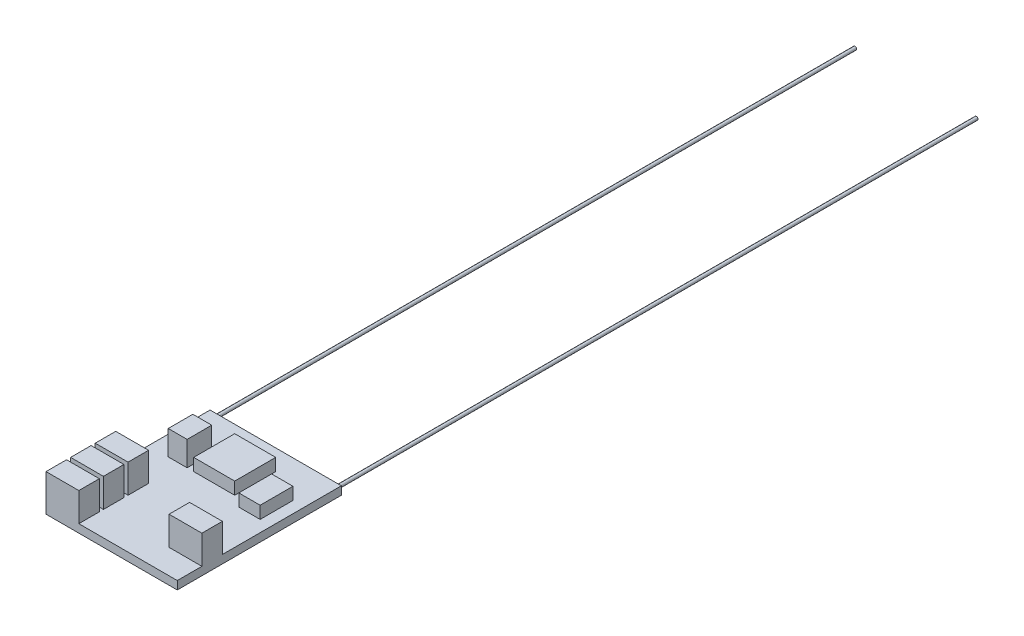
ISO-10303-21;
HEADER;
FILE_DESCRIPTION(('STEP AP214'),'2;1');
FILE_NAME('part.step','',(''),(''),'','','');
FILE_SCHEMA(('AUTOMOTIVE_DESIGN { 1 0 10303 214 1 1 1 1 }'));
ENDSEC;
DATA;
#1=APPLICATION_CONTEXT('core data for automotive mechanical design processes');
#2=APPLICATION_PROTOCOL_DEFINITION('international standard','automotive_design',2000,#1);
#3=PRODUCT_CONTEXT('',#1,'mechanical');
#4=PRODUCT('Part','Part','',(#3));
#5=PRODUCT_RELATED_PRODUCT_CATEGORY('part','',(#4));
#6=PRODUCT_DEFINITION_FORMATION('','',#4);
#7=PRODUCT_DEFINITION_CONTEXT('part definition',#1,'design');
#8=PRODUCT_DEFINITION('design','',#6,#7);
#9=PRODUCT_DEFINITION_SHAPE('','',#8);
#10=(LENGTH_UNIT() NAMED_UNIT(*) SI_UNIT(.MILLI.,.METRE.));
#11=(NAMED_UNIT(*) PLANE_ANGLE_UNIT() SI_UNIT($,.RADIAN.));
#12=(NAMED_UNIT(*) SI_UNIT($,.STERADIAN.) SOLID_ANGLE_UNIT());
#13=UNCERTAINTY_MEASURE_WITH_UNIT(LENGTH_MEASURE(1.E-05),#10,'distance_accuracy_value','');
#14=(GEOMETRIC_REPRESENTATION_CONTEXT(3) GLOBAL_UNCERTAINTY_ASSIGNED_CONTEXT((#13)) GLOBAL_UNIT_ASSIGNED_CONTEXT((#10,
#11,#12)) REPRESENTATION_CONTEXT('',''));
#15=CARTESIAN_POINT('',(0.,0.,0.));
#16=DIRECTION('',(0.,0.,1.));
#17=DIRECTION('',(1.,0.,0.));
#18=AXIS2_PLACEMENT_3D('',#15,#16,#17);
#19=CARTESIAN_POINT('',(0.,1.,0.));
#20=DIRECTION('',(0.,-1.,0.));
#21=DIRECTION('',(0.,0.,-1.));
#22=AXIS2_PLACEMENT_3D('',#19,#20,#21);
#23=PLANE('',#22);
#24=DIRECTION('',(0.,0.,1.));
#25=VECTOR('',#24,1.);
#26=CARTESIAN_POINT('',(4.,1.,-1.5));
#27=LINE('',#26,#25);
#28=CARTESIAN_POINT('',(4.,1.,-5.5));
#29=VERTEX_POINT('',#28);
#30=CARTESIAN_POINT('',(4.,1.,-1.5));
#31=VERTEX_POINT('',#30);
#32=EDGE_CURVE('E260',#29,#31,#27,.T.);
#33=ORIENTED_EDGE('',*,*,#32,.F.);
#34=DIRECTION('',(-1.,0.,0.));
#35=VECTOR('',#34,1.);
#36=CARTESIAN_POINT('',(4.,1.,-5.5));
#37=LINE('',#36,#35);
#38=CARTESIAN_POINT('',(6.6,1.,-5.5));
#39=VERTEX_POINT('',#38);
#40=EDGE_CURVE('E273',#39,#29,#37,.T.);
#41=ORIENTED_EDGE('',*,*,#40,.F.);
#42=DIRECTION('',(0.,0.,-1.));
#43=VECTOR('',#42,1.);
#44=CARTESIAN_POINT('',(6.6,1.,-1.5));
#45=LINE('',#44,#43);
#46=CARTESIAN_POINT('',(6.6,1.,-1.5));
#47=VERTEX_POINT('',#46);
#48=EDGE_CURVE('E282',#47,#39,#45,.T.);
#49=ORIENTED_EDGE('',*,*,#48,.F.);
#50=DIRECTION('',(1.,0.,0.));
#51=VECTOR('',#50,1.);
#52=CARTESIAN_POINT('',(4.,1.,-1.5));
#53=LINE('',#52,#51);
#54=EDGE_CURVE('E263',#31,#47,#53,.T.);
#55=ORIENTED_EDGE('',*,*,#54,.F.);
#56=EDGE_LOOP('',(#33,#41,#49,#55));
#57=FACE_BOUND('',#56,.T.);
#58=DIRECTION('',(-1.,0.,0.));
#59=VECTOR('',#58,1.);
#60=CARTESIAN_POINT('',(8.,1.,4.5));
#61=LINE('',#60,#59);
#62=CARTESIAN_POINT('',(8.,1.,4.5));
#63=VERTEX_POINT('',#62);
#64=CARTESIAN_POINT('',(4.,1.,4.5));
#65=VERTEX_POINT('',#64);
#66=EDGE_CURVE('E331',#63,#65,#61,.T.);
#67=ORIENTED_EDGE('',*,*,#66,.F.);
#68=DIRECTION('',(0.,0.,-1.));
#69=VECTOR('',#68,1.);
#70=CARTESIAN_POINT('',(8.,1.,10.));
#71=LINE('',#70,#69);
#72=CARTESIAN_POINT('',(8.,1.,-10.));
#73=VERTEX_POINT('',#72);
#74=EDGE_CURVE('E449',#63,#73,#71,.T.);
#75=ORIENTED_EDGE('',*,*,#74,.T.);
#76=DIRECTION('',(-1.,0.,0.));
#77=VECTOR('',#76,1.);
#78=CARTESIAN_POINT('',(-8.,1.,-10.));
#79=LINE('',#78,#77);
#80=CARTESIAN_POINT('',(-8.,1.,-10.));
#81=VERTEX_POINT('',#80);
#82=EDGE_CURVE('E448',#73,#81,#79,.T.);
#83=ORIENTED_EDGE('',*,*,#82,.T.);
#84=DIRECTION('',(0.,0.,1.));
#85=VECTOR('',#84,1.);
#86=CARTESIAN_POINT('',(-8.,1.,10.));
#87=LINE('',#86,#85);
#88=CARTESIAN_POINT('',(-8.,1.,1.5));
#89=VERTEX_POINT('',#88);
#90=EDGE_CURVE('E452',#81,#89,#87,.T.);
#91=ORIENTED_EDGE('',*,*,#90,.T.);
#92=DIRECTION('',(-1.,0.,0.));
#93=VECTOR('',#92,1.);
#94=CARTESIAN_POINT('',(-8.,1.,1.5));
#95=LINE('',#94,#93);
#96=CARTESIAN_POINT('',(-4.,1.,1.5));
#97=VERTEX_POINT('',#96);
#98=EDGE_CURVE('E366',#97,#89,#95,.T.);
#99=ORIENTED_EDGE('',*,*,#98,.F.);
#100=DIRECTION('',(0.,0.,-1.));
#101=VECTOR('',#100,1.);
#102=CARTESIAN_POINT('',(-4.,1.,4.));
#103=LINE('',#102,#101);
#104=CARTESIAN_POINT('',(-4.,1.,4.));
#105=VERTEX_POINT('',#104);
#106=EDGE_CURVE('E375',#105,#97,#103,.T.);
#107=ORIENTED_EDGE('',*,*,#106,.F.);
#108=DIRECTION('',(1.,0.,0.));
#109=VECTOR('',#108,1.);
#110=CARTESIAN_POINT('',(-8.,1.,4.));
#111=LINE('',#110,#109);
#112=CARTESIAN_POINT('',(-8.,1.,4.));
#113=VERTEX_POINT('',#112);
#114=EDGE_CURVE('E361',#113,#105,#111,.T.);
#115=ORIENTED_EDGE('',*,*,#114,.F.);
#116=CARTESIAN_POINT('',(-8.,1.,4.5));
#117=VERTEX_POINT('',#116);
#118=EDGE_CURVE('E455',#113,#117,#87,.T.);
#119=ORIENTED_EDGE('',*,*,#118,.T.);
#120=DIRECTION('',(-1.,0.,0.));
#121=VECTOR('',#120,1.);
#122=CARTESIAN_POINT('',(-8.,1.,4.5));
#123=LINE('',#122,#121);
#124=CARTESIAN_POINT('',(-4.,1.,4.5));
#125=VERTEX_POINT('',#124);
#126=EDGE_CURVE('E396',#125,#117,#123,.T.);
#127=ORIENTED_EDGE('',*,*,#126,.F.);
#128=DIRECTION('',(0.,0.,-1.));
#129=VECTOR('',#128,1.);
#130=CARTESIAN_POINT('',(-4.,1.,7.));
#131=LINE('',#130,#129);
#132=CARTESIAN_POINT('',(-4.,1.,7.));
#133=VERTEX_POINT('',#132);
#134=EDGE_CURVE('E405',#133,#125,#131,.T.);
#135=ORIENTED_EDGE('',*,*,#134,.F.);
#136=DIRECTION('',(1.,0.,0.));
#137=VECTOR('',#136,1.);
#138=CARTESIAN_POINT('',(-8.,1.,7.));
#139=LINE('',#138,#137);
#140=CARTESIAN_POINT('',(-8.,1.,7.));
#141=VERTEX_POINT('',#140);
#142=EDGE_CURVE('E391',#141,#133,#139,.T.);
#143=ORIENTED_EDGE('',*,*,#142,.F.);
#144=CARTESIAN_POINT('',(-8.,1.,7.5));
#145=VERTEX_POINT('',#144);
#146=EDGE_CURVE('E451',#141,#145,#87,.T.);
#147=ORIENTED_EDGE('',*,*,#146,.T.);
#148=DIRECTION('',(-1.,0.,0.));
#149=VECTOR('',#148,1.);
#150=CARTESIAN_POINT('',(-8.,1.,7.5));
#151=LINE('',#150,#149);
#152=CARTESIAN_POINT('',(-4.,1.,7.5));
#153=VERTEX_POINT('',#152);
#154=EDGE_CURVE('E426',#153,#145,#151,.T.);
#155=ORIENTED_EDGE('',*,*,#154,.F.);
#156=DIRECTION('',(0.,0.,-1.));
#157=VECTOR('',#156,1.);
#158=CARTESIAN_POINT('',(-4.,1.,10.));
#159=LINE('',#158,#157);
#160=CARTESIAN_POINT('',(-4.,1.,10.));
#161=VERTEX_POINT('',#160);
#162=EDGE_CURVE('E421',#161,#153,#159,.T.);
#163=ORIENTED_EDGE('',*,*,#162,.F.);
#164=DIRECTION('',(1.,0.,0.));
#165=VECTOR('',#164,1.);
#166=CARTESIAN_POINT('',(-8.,1.,10.));
#167=LINE('',#166,#165);
#168=CARTESIAN_POINT('',(8.,1.,10.));
#169=VERTEX_POINT('',#168);
#170=EDGE_CURVE('E454',#161,#169,#167,.T.);
#171=ORIENTED_EDGE('',*,*,#170,.T.);
#172=CARTESIAN_POINT('',(8.,1.,7.));
#173=VERTEX_POINT('',#172);
#174=EDGE_CURVE('E446',#169,#173,#71,.T.);
#175=ORIENTED_EDGE('',*,*,#174,.T.);
#176=DIRECTION('',(1.,0.,0.));
#177=VECTOR('',#176,1.);
#178=CARTESIAN_POINT('',(8.,1.,7.));
#179=LINE('',#178,#177);
#180=CARTESIAN_POINT('',(4.,1.,7.));
#181=VERTEX_POINT('',#180);
#182=EDGE_CURVE('E336',#181,#173,#179,.T.);
#183=ORIENTED_EDGE('',*,*,#182,.F.);
#184=DIRECTION('',(0.,0.,1.));
#185=VECTOR('',#184,1.);
#186=CARTESIAN_POINT('',(4.,1.,7.));
#187=LINE('',#186,#185);
#188=EDGE_CURVE('E345',#65,#181,#187,.T.);
#189=ORIENTED_EDGE('',*,*,#188,.F.);
#190=EDGE_LOOP('',(#67,#75,#83,#91,#99,#107,#115,#119,#127,#135,#143,#147,#155,#163,#171,#175,
#183,#189));
#191=FACE_BOUND('',#190,.T.);
#192=DIRECTION('',(0.,0.,-1.));
#193=VECTOR('',#192,1.);
#194=CARTESIAN_POINT('',(2.5,1.,-2.5));
#195=LINE('',#194,#193);
#196=CARTESIAN_POINT('',(2.5,1.,-2.5));
#197=VERTEX_POINT('',#196);
#198=CARTESIAN_POINT('',(2.5,1.,-7.5));
#199=VERTEX_POINT('',#198);
#200=EDGE_CURVE('E298',#197,#199,#195,.T.);
#201=ORIENTED_EDGE('',*,*,#200,.F.);
#202=DIRECTION('',(1.,0.,0.));
#203=VECTOR('',#202,1.);
#204=CARTESIAN_POINT('',(-2.5,1.,-2.5));
#205=LINE('',#204,#203);
#206=CARTESIAN_POINT('',(-2.5,1.,-2.5));
#207=VERTEX_POINT('',#206);
#208=EDGE_CURVE('E303',#207,#197,#205,.T.);
#209=ORIENTED_EDGE('',*,*,#208,.F.);
#210=DIRECTION('',(0.,0.,1.));
#211=VECTOR('',#210,1.);
#212=CARTESIAN_POINT('',(-2.5,1.,-2.5));
#213=LINE('',#212,#211);
#214=CARTESIAN_POINT('',(-2.5,1.,-7.5));
#215=VERTEX_POINT('',#214);
#216=EDGE_CURVE('E315',#215,#207,#213,.T.);
#217=ORIENTED_EDGE('',*,*,#216,.F.);
#218=DIRECTION('',(-1.,0.,0.));
#219=VECTOR('',#218,1.);
#220=CARTESIAN_POINT('',(-2.5,1.,-7.5));
#221=LINE('',#220,#219);
#222=EDGE_CURVE('E312',#199,#215,#221,.T.);
#223=ORIENTED_EDGE('',*,*,#222,.F.);
#224=EDGE_LOOP('',(#201,#209,#217,#223));
#225=FACE_BOUND('',#224,.T.);
#226=DIRECTION('',(0.,0.,-1.));
#227=VECTOR('',#226,1.);
#228=CARTESIAN_POINT('',(-3.3,1.,-2.5));
#229=LINE('',#228,#227);
#230=CARTESIAN_POINT('',(-3.3,1.,-2.5));
#231=VERTEX_POINT('',#230);
#232=CARTESIAN_POINT('',(-3.3,1.,-5.5));
#233=VERTEX_POINT('',#232);
#234=EDGE_CURVE('E259',#231,#233,#229,.T.);
#235=ORIENTED_EDGE('',*,*,#234,.F.);
#236=DIRECTION('',(1.,0.,0.));
#237=VECTOR('',#236,1.);
#238=CARTESIAN_POINT('',(-3.3,1.,-2.5));
#239=LINE('',#238,#237);
#240=CARTESIAN_POINT('',(-5.60257448826876,1.,-2.5));
#241=VERTEX_POINT('',#240);
#242=EDGE_CURVE('E256',#241,#231,#239,.T.);
#243=ORIENTED_EDGE('',*,*,#242,.F.);
#244=DIRECTION('',(0.,0.,1.));
#245=VECTOR('',#244,1.);
#246=CARTESIAN_POINT('',(-5.60257448826876,1.,-2.5));
#247=LINE('',#246,#245);
#248=CARTESIAN_POINT('',(-5.60257448826876,1.,-5.5));
#249=VERTEX_POINT('',#248);
#250=EDGE_CURVE('E56',#249,#241,#247,.T.);
#251=ORIENTED_EDGE('',*,*,#250,.F.);
#252=DIRECTION('',(-1.,0.,0.));
#253=VECTOR('',#252,1.);
#254=CARTESIAN_POINT('',(-3.3,1.,-5.5));
#255=LINE('',#254,#253);
#256=EDGE_CURVE('E51',#233,#249,#255,.T.);
#257=ORIENTED_EDGE('',*,*,#256,.F.);
#258=EDGE_LOOP('',(#235,#243,#251,#257));
#259=FACE_BOUND('',#258,.T.);
#260=ADVANCED_FACE('F36',(#57,#191,#225,#259),#23,.F.);
#261=CARTESIAN_POINT('',(8.,1.,10.));
#262=DIRECTION('',(-1.,0.,0.));
#263=DIRECTION('',(0.,0.,1.));
#264=AXIS2_PLACEMENT_3D('',#261,#262,#263);
#265=PLANE('',#264);
#266=DIRECTION('',(0.,0.,-1.));
#267=VECTOR('',#266,1.);
#268=CARTESIAN_POINT('',(8.,0.,10.));
#269=LINE('',#268,#267);
#270=CARTESIAN_POINT('',(8.,0.,10.));
#271=VERTEX_POINT('',#270);
#272=CARTESIAN_POINT('',(8.,0.,-10.));
#273=VERTEX_POINT('',#272);
#274=EDGE_CURVE('E445',#271,#273,#269,.T.);
#275=ORIENTED_EDGE('',*,*,#274,.T.);
#276=DIRECTION('',(0.,-1.,0.));
#277=VECTOR('',#276,1.);
#278=CARTESIAN_POINT('',(8.,1.,-10.));
#279=LINE('',#278,#277);
#280=EDGE_CURVE('E474',#73,#273,#279,.T.);
#281=ORIENTED_EDGE('',*,*,#280,.F.);
#282=ORIENTED_EDGE('',*,*,#74,.F.);
#283=DIRECTION('',(0.,-1.,0.));
#284=VECTOR('',#283,1.);
#285=CARTESIAN_POINT('',(8.,4.5,4.5));
#286=LINE('',#285,#284);
#287=CARTESIAN_POINT('',(8.,4.5,4.5));
#288=VERTEX_POINT('',#287);
#289=EDGE_CURVE('E358',#288,#63,#286,.T.);
#290=ORIENTED_EDGE('',*,*,#289,.F.);
#291=DIRECTION('',(0.,0.,-1.));
#292=VECTOR('',#291,1.);
#293=CARTESIAN_POINT('',(8.,4.5,7.));
#294=LINE('',#293,#292);
#295=CARTESIAN_POINT('',(8.,4.5,7.));
#296=VERTEX_POINT('',#295);
#297=EDGE_CURVE('E332',#296,#288,#294,.T.);
#298=ORIENTED_EDGE('',*,*,#297,.F.);
#299=DIRECTION('',(0.,-1.,0.));
#300=VECTOR('',#299,1.);
#301=CARTESIAN_POINT('',(8.,4.5,7.));
#302=LINE('',#301,#300);
#303=EDGE_CURVE('E342',#296,#173,#302,.T.);
#304=ORIENTED_EDGE('',*,*,#303,.T.);
#305=ORIENTED_EDGE('',*,*,#174,.F.);
#306=DIRECTION('',(0.,-1.,0.));
#307=VECTOR('',#306,1.);
#308=CARTESIAN_POINT('',(8.,1.,10.));
#309=LINE('',#308,#307);
#310=EDGE_CURVE('E457',#169,#271,#309,.T.);
#311=ORIENTED_EDGE('',*,*,#310,.T.);
#312=EDGE_LOOP('',(#275,#281,#282,#290,#298,#304,#305,#311));
#313=FACE_BOUND('',#312,.T.);
#314=ADVANCED_FACE('F38',(#313),#265,.F.);
#315=CARTESIAN_POINT('',(-8.,1.,-10.));
#316=DIRECTION('',(0.,0.,1.));
#317=DIRECTION('',(1.,0.,0.));
#318=AXIS2_PLACEMENT_3D('',#315,#316,#317);
#319=PLANE('',#318);
#320=CARTESIAN_POINT('',(7.4,0.5,-9.99999999999999));
#321=DIRECTION('',(0.,0.,1.));
#322=DIRECTION('',(1.,0.,0.));
#323=AXIS2_PLACEMENT_3D('',#320,#321,#322);
#324=CIRCLE('',#323,0.2);
#325=CARTESIAN_POINT('',(7.6,0.5,-9.99999999999999));
#326=VERTEX_POINT('',#325);
#327=EDGE_CURVE('E11',#326,#326,#324,.F.);
#328=ORIENTED_EDGE('',*,*,#327,.F.);
#329=EDGE_LOOP('',(#328));
#330=FACE_BOUND('',#329,.T.);
#331=CARTESIAN_POINT('',(-7.4,0.5,-9.99999999999999));
#332=DIRECTION('',(0.,0.,1.));
#333=DIRECTION('',(1.,0.,0.));
#334=AXIS2_PLACEMENT_3D('',#331,#332,#333);
#335=CIRCLE('',#334,0.2);
#336=CARTESIAN_POINT('',(-7.2,0.5,-9.99999999999999));
#337=VERTEX_POINT('',#336);
#338=EDGE_CURVE('E44',#337,#337,#335,.F.);
#339=ORIENTED_EDGE('',*,*,#338,.F.);
#340=EDGE_LOOP('',(#339));
#341=FACE_BOUND('',#340,.T.);
#342=DIRECTION('',(-1.,0.,0.));
#343=VECTOR('',#342,1.);
#344=CARTESIAN_POINT('',(-8.,0.,-10.));
#345=LINE('',#344,#343);
#346=CARTESIAN_POINT('',(-8.,0.,-10.));
#347=VERTEX_POINT('',#346);
#348=EDGE_CURVE('E460',#273,#347,#345,.T.);
#349=ORIENTED_EDGE('',*,*,#348,.T.);
#350=DIRECTION('',(0.,-1.,0.));
#351=VECTOR('',#350,1.);
#352=CARTESIAN_POINT('',(-8.,1.,-10.));
#353=LINE('',#352,#351);
#354=EDGE_CURVE('E471',#81,#347,#353,.T.);
#355=ORIENTED_EDGE('',*,*,#354,.F.);
#356=ORIENTED_EDGE('',*,*,#82,.F.);
#357=ORIENTED_EDGE('',*,*,#280,.T.);
#358=EDGE_LOOP('',(#349,#355,#356,#357));
#359=FACE_BOUND('',#358,.T.);
#360=ADVANCED_FACE('F481',(#330,#341,#359),#319,.F.);
#361=CARTESIAN_POINT('',(-8.,1.,10.));
#362=DIRECTION('',(1.,0.,0.));
#363=DIRECTION('',(0.,0.,-1.));
#364=AXIS2_PLACEMENT_3D('',#361,#362,#363);
#365=PLANE('',#364);
#366=DIRECTION('',(0.,0.,1.));
#367=VECTOR('',#366,1.);
#368=CARTESIAN_POINT('',(-8.,0.,10.));
#369=LINE('',#368,#367);
#370=CARTESIAN_POINT('',(-8.,0.,10.));
#371=VERTEX_POINT('',#370);
#372=EDGE_CURVE('E462',#347,#371,#369,.T.);
#373=ORIENTED_EDGE('',*,*,#372,.T.);
#374=DIRECTION('',(0.,-1.,0.));
#375=VECTOR('',#374,1.);
#376=CARTESIAN_POINT('',(-8.,1.,10.));
#377=LINE('',#376,#375);
#378=CARTESIAN_POINT('',(-8.,4.5,10.));
#379=VERTEX_POINT('',#378);
#380=EDGE_CURVE('E468',#379,#371,#377,.T.);
#381=ORIENTED_EDGE('',*,*,#380,.F.);
#382=DIRECTION('',(0.,0.,1.));
#383=VECTOR('',#382,1.);
#384=CARTESIAN_POINT('',(-8.,4.5,10.));
#385=LINE('',#384,#383);
#386=CARTESIAN_POINT('',(-8.,4.5,7.5));
#387=VERTEX_POINT('',#386);
#388=EDGE_CURVE('E422',#387,#379,#385,.T.);
#389=ORIENTED_EDGE('',*,*,#388,.F.);
#390=DIRECTION('',(0.,-1.,0.));
#391=VECTOR('',#390,1.);
#392=CARTESIAN_POINT('',(-8.,4.5,7.5));
#393=LINE('',#392,#391);
#394=EDGE_CURVE('E432',#387,#145,#393,.T.);
#395=ORIENTED_EDGE('',*,*,#394,.T.);
#396=ORIENTED_EDGE('',*,*,#146,.F.);
#397=DIRECTION('',(0.,-1.,0.));
#398=VECTOR('',#397,1.);
#399=CARTESIAN_POINT('',(-8.,4.5,7.));
#400=LINE('',#399,#398);
#401=CARTESIAN_POINT('',(-8.,4.5,7.));
#402=VERTEX_POINT('',#401);
#403=EDGE_CURVE('E402',#402,#141,#400,.T.);
#404=ORIENTED_EDGE('',*,*,#403,.F.);
#405=DIRECTION('',(0.,0.,1.));
#406=VECTOR('',#405,1.);
#407=CARTESIAN_POINT('',(-8.,4.5,7.));
#408=LINE('',#407,#406);
#409=CARTESIAN_POINT('',(-8.,4.5,4.5));
#410=VERTEX_POINT('',#409);
#411=EDGE_CURVE('E400',#410,#402,#408,.T.);
#412=ORIENTED_EDGE('',*,*,#411,.F.);
#413=DIRECTION('',(0.,-1.,0.));
#414=VECTOR('',#413,1.);
#415=CARTESIAN_POINT('',(-8.,4.5,4.5));
#416=LINE('',#415,#414);
#417=EDGE_CURVE('E412',#410,#117,#416,.T.);
#418=ORIENTED_EDGE('',*,*,#417,.T.);
#419=ORIENTED_EDGE('',*,*,#118,.F.);
#420=DIRECTION('',(0.,-1.,0.));
#421=VECTOR('',#420,1.);
#422=CARTESIAN_POINT('',(-8.,4.5,4.));
#423=LINE('',#422,#421);
#424=CARTESIAN_POINT('',(-8.,4.5,4.));
#425=VERTEX_POINT('',#424);
#426=EDGE_CURVE('E372',#425,#113,#423,.T.);
#427=ORIENTED_EDGE('',*,*,#426,.F.);
#428=DIRECTION('',(0.,0.,1.));
#429=VECTOR('',#428,1.);
#430=CARTESIAN_POINT('',(-8.,4.5,4.));
#431=LINE('',#430,#429);
#432=CARTESIAN_POINT('',(-8.,4.5,1.5));
#433=VERTEX_POINT('',#432);
#434=EDGE_CURVE('E370',#433,#425,#431,.T.);
#435=ORIENTED_EDGE('',*,*,#434,.F.);
#436=DIRECTION('',(0.,-1.,0.));
#437=VECTOR('',#436,1.);
#438=CARTESIAN_POINT('',(-8.,4.5,1.5));
#439=LINE('',#438,#437);
#440=EDGE_CURVE('E382',#433,#89,#439,.T.);
#441=ORIENTED_EDGE('',*,*,#440,.T.);
#442=ORIENTED_EDGE('',*,*,#90,.F.);
#443=ORIENTED_EDGE('',*,*,#354,.T.);
#444=EDGE_LOOP('',(#373,#381,#389,#395,#396,#404,#412,#418,#419,#427,#435,#441,#442,#443));
#445=FACE_BOUND('',#444,.T.);
#446=ADVANCED_FACE('F484',(#445),#365,.F.);
#447=CARTESIAN_POINT('',(-8.,1.,10.));
#448=DIRECTION('',(0.,0.,-1.));
#449=DIRECTION('',(-1.,0.,0.));
#450=AXIS2_PLACEMENT_3D('',#447,#448,#449);
#451=PLANE('',#450);
#452=DIRECTION('',(1.,0.,0.));
#453=VECTOR('',#452,1.);
#454=CARTESIAN_POINT('',(-8.,0.,10.));
#455=LINE('',#454,#453);
#456=EDGE_CURVE('E464',#371,#271,#455,.T.);
#457=ORIENTED_EDGE('',*,*,#456,.T.);
#458=ORIENTED_EDGE('',*,*,#310,.F.);
#459=ORIENTED_EDGE('',*,*,#170,.F.);
#460=DIRECTION('',(0.,-1.,0.));
#461=VECTOR('',#460,1.);
#462=CARTESIAN_POINT('',(-4.,4.5,10.));
#463=LINE('',#462,#461);
#464=CARTESIAN_POINT('',(-4.,4.5,10.));
#465=VERTEX_POINT('',#464);
#466=EDGE_CURVE('E442',#465,#161,#463,.T.);
#467=ORIENTED_EDGE('',*,*,#466,.F.);
#468=DIRECTION('',(1.,0.,0.));
#469=VECTOR('',#468,1.);
#470=CARTESIAN_POINT('',(-8.,4.5,10.));
#471=LINE('',#470,#469);
#472=EDGE_CURVE('E425',#379,#465,#471,.T.);
#473=ORIENTED_EDGE('',*,*,#472,.F.);
#474=ORIENTED_EDGE('',*,*,#380,.T.);
#475=EDGE_LOOP('',(#457,#458,#459,#467,#473,#474));
#476=FACE_BOUND('',#475,.T.);
#477=ADVANCED_FACE('F498',(#476),#451,.F.);
#478=CARTESIAN_POINT('',(0.,0.,0.));
#479=DIRECTION('',(0.,-1.,0.));
#480=DIRECTION('',(0.,0.,-1.));
#481=AXIS2_PLACEMENT_3D('',#478,#479,#480);
#482=PLANE('',#481);
#483=ORIENTED_EDGE('',*,*,#274,.F.);
#484=ORIENTED_EDGE('',*,*,#456,.F.);
#485=ORIENTED_EDGE('',*,*,#372,.F.);
#486=ORIENTED_EDGE('',*,*,#348,.F.);
#487=EDGE_LOOP('',(#483,#484,#485,#486));
#488=FACE_BOUND('',#487,.T.);
#489=ADVANCED_FACE('F495',(#488),#482,.T.);
#490=CARTESIAN_POINT('',(-4.,4.5,10.));
#491=DIRECTION('',(-1.,0.,0.));
#492=DIRECTION('',(0.,0.,1.));
#493=AXIS2_PLACEMENT_3D('',#490,#491,#492);
#494=PLANE('',#493);
#495=ORIENTED_EDGE('',*,*,#162,.T.);
#496=DIRECTION('',(0.,-1.,0.));
#497=VECTOR('',#496,1.);
#498=CARTESIAN_POINT('',(-4.,4.5,7.5));
#499=LINE('',#498,#497);
#500=CARTESIAN_POINT('',(-4.,4.5,7.5));
#501=VERTEX_POINT('',#500);
#502=EDGE_CURVE('E439',#501,#153,#499,.T.);
#503=ORIENTED_EDGE('',*,*,#502,.F.);
#504=DIRECTION('',(0.,0.,-1.));
#505=VECTOR('',#504,1.);
#506=CARTESIAN_POINT('',(-4.,4.5,10.));
#507=LINE('',#506,#505);
#508=EDGE_CURVE('E428',#465,#501,#507,.T.);
#509=ORIENTED_EDGE('',*,*,#508,.F.);
#510=ORIENTED_EDGE('',*,*,#466,.T.);
#511=EDGE_LOOP('',(#495,#503,#509,#510));
#512=FACE_BOUND('',#511,.T.);
#513=ADVANCED_FACE('F554',(#512),#494,.F.);
#514=CARTESIAN_POINT('',(-8.,4.5,7.5));
#515=DIRECTION('',(0.,0.,1.));
#516=DIRECTION('',(1.,0.,0.));
#517=AXIS2_PLACEMENT_3D('',#514,#515,#516);
#518=PLANE('',#517);
#519=ORIENTED_EDGE('',*,*,#154,.T.);
#520=ORIENTED_EDGE('',*,*,#394,.F.);
#521=DIRECTION('',(-1.,0.,0.));
#522=VECTOR('',#521,1.);
#523=CARTESIAN_POINT('',(-8.,4.5,7.5));
#524=LINE('',#523,#522);
#525=EDGE_CURVE('E430',#501,#387,#524,.T.);
#526=ORIENTED_EDGE('',*,*,#525,.F.);
#527=ORIENTED_EDGE('',*,*,#502,.T.);
#528=EDGE_LOOP('',(#519,#520,#526,#527));
#529=FACE_BOUND('',#528,.T.);
#530=ADVANCED_FACE('F580',(#529),#518,.F.);
#531=CARTESIAN_POINT('',(0.,4.5,0.));
#532=DIRECTION('',(0.,-1.,0.));
#533=DIRECTION('',(0.,0.,-1.));
#534=AXIS2_PLACEMENT_3D('',#531,#532,#533);
#535=PLANE('',#534);
#536=ORIENTED_EDGE('',*,*,#388,.T.);
#537=ORIENTED_EDGE('',*,*,#472,.T.);
#538=ORIENTED_EDGE('',*,*,#508,.T.);
#539=ORIENTED_EDGE('',*,*,#525,.T.);
#540=EDGE_LOOP('',(#536,#537,#538,#539));
#541=FACE_BOUND('',#540,.T.);
#542=ADVANCED_FACE('F587',(#541),#535,.F.);
#543=CARTESIAN_POINT('',(-8.,4.5,7.));
#544=DIRECTION('',(0.,0.,-1.));
#545=DIRECTION('',(-1.,0.,0.));
#546=AXIS2_PLACEMENT_3D('',#543,#544,#545);
#547=PLANE('',#546);
#548=ORIENTED_EDGE('',*,*,#142,.T.);
#549=DIRECTION('',(0.,-1.,0.));
#550=VECTOR('',#549,1.);
#551=CARTESIAN_POINT('',(-4.,4.5,7.));
#552=LINE('',#551,#550);
#553=CARTESIAN_POINT('',(-4.,4.5,7.));
#554=VERTEX_POINT('',#553);
#555=EDGE_CURVE('E418',#554,#133,#552,.T.);
#556=ORIENTED_EDGE('',*,*,#555,.F.);
#557=DIRECTION('',(1.,0.,0.));
#558=VECTOR('',#557,1.);
#559=CARTESIAN_POINT('',(-8.,4.5,7.));
#560=LINE('',#559,#558);
#561=EDGE_CURVE('E392',#402,#554,#560,.T.);
#562=ORIENTED_EDGE('',*,*,#561,.F.);
#563=ORIENTED_EDGE('',*,*,#403,.T.);
#564=EDGE_LOOP('',(#548,#556,#562,#563));
#565=FACE_BOUND('',#564,.T.);
#566=ADVANCED_FACE('F594',(#565),#547,.F.);
#567=CARTESIAN_POINT('',(-4.,4.5,7.));
#568=DIRECTION('',(-1.,0.,0.));
#569=DIRECTION('',(0.,0.,1.));
#570=AXIS2_PLACEMENT_3D('',#567,#568,#569);
#571=PLANE('',#570);
#572=ORIENTED_EDGE('',*,*,#134,.T.);
#573=DIRECTION('',(0.,-1.,0.));
#574=VECTOR('',#573,1.);
#575=CARTESIAN_POINT('',(-4.,4.5,4.5));
#576=LINE('',#575,#574);
#577=CARTESIAN_POINT('',(-4.,4.5,4.5));
#578=VERTEX_POINT('',#577);
#579=EDGE_CURVE('E415',#578,#125,#576,.T.);
#580=ORIENTED_EDGE('',*,*,#579,.F.);
#581=DIRECTION('',(0.,0.,-1.));
#582=VECTOR('',#581,1.);
#583=CARTESIAN_POINT('',(-4.,4.5,7.));
#584=LINE('',#583,#582);
#585=EDGE_CURVE('E395',#554,#578,#584,.T.);
#586=ORIENTED_EDGE('',*,*,#585,.F.);
#587=ORIENTED_EDGE('',*,*,#555,.T.);
#588=EDGE_LOOP('',(#572,#580,#586,#587));
#589=FACE_BOUND('',#588,.T.);
#590=ADVANCED_FACE('F602',(#589),#571,.F.);
#591=CARTESIAN_POINT('',(-8.,4.5,4.5));
#592=DIRECTION('',(0.,0.,1.));
#593=DIRECTION('',(1.,0.,0.));
#594=AXIS2_PLACEMENT_3D('',#591,#592,#593);
#595=PLANE('',#594);
#596=ORIENTED_EDGE('',*,*,#126,.T.);
#597=ORIENTED_EDGE('',*,*,#417,.F.);
#598=DIRECTION('',(-1.,0.,0.));
#599=VECTOR('',#598,1.);
#600=CARTESIAN_POINT('',(-8.,4.5,4.5));
#601=LINE('',#600,#599);
#602=EDGE_CURVE('E398',#578,#410,#601,.T.);
#603=ORIENTED_EDGE('',*,*,#602,.F.);
#604=ORIENTED_EDGE('',*,*,#579,.T.);
#605=EDGE_LOOP('',(#596,#597,#603,#604));
#606=FACE_BOUND('',#605,.T.);
#607=ADVANCED_FACE('F543',(#606),#595,.F.);
#608=CARTESIAN_POINT('',(0.,4.5,0.));
#609=DIRECTION('',(0.,1.,0.));
#610=DIRECTION('',(0.,0.,1.));
#611=AXIS2_PLACEMENT_3D('',#608,#609,#610);
#612=PLANE('',#611);
#613=ORIENTED_EDGE('',*,*,#561,.T.);
#614=ORIENTED_EDGE('',*,*,#585,.T.);
#615=ORIENTED_EDGE('',*,*,#602,.T.);
#616=ORIENTED_EDGE('',*,*,#411,.T.);
#617=EDGE_LOOP('',(#613,#614,#615,#616));
#618=FACE_BOUND('',#617,.T.);
#619=ADVANCED_FACE('F536',(#618),#612,.T.);
#620=CARTESIAN_POINT('',(-8.,4.5,4.));
#621=DIRECTION('',(0.,0.,-1.));
#622=DIRECTION('',(-1.,0.,0.));
#623=AXIS2_PLACEMENT_3D('',#620,#621,#622);
#624=PLANE('',#623);
#625=ORIENTED_EDGE('',*,*,#114,.T.);
#626=DIRECTION('',(0.,-1.,0.));
#627=VECTOR('',#626,1.);
#628=CARTESIAN_POINT('',(-4.,4.5,4.));
#629=LINE('',#628,#627);
#630=CARTESIAN_POINT('',(-4.,4.5,4.));
#631=VERTEX_POINT('',#630);
#632=EDGE_CURVE('E388',#631,#105,#629,.T.);
#633=ORIENTED_EDGE('',*,*,#632,.F.);
#634=DIRECTION('',(1.,0.,0.));
#635=VECTOR('',#634,1.);
#636=CARTESIAN_POINT('',(-8.,4.5,4.));
#637=LINE('',#636,#635);
#638=EDGE_CURVE('E362',#425,#631,#637,.T.);
#639=ORIENTED_EDGE('',*,*,#638,.F.);
#640=ORIENTED_EDGE('',*,*,#426,.T.);
#641=EDGE_LOOP('',(#625,#633,#639,#640));
#642=FACE_BOUND('',#641,.T.);
#643=ADVANCED_FACE('F534',(#642),#624,.F.);
#644=CARTESIAN_POINT('',(-4.,4.5,4.));
#645=DIRECTION('',(-1.,0.,0.));
#646=DIRECTION('',(0.,0.,1.));
#647=AXIS2_PLACEMENT_3D('',#644,#645,#646);
#648=PLANE('',#647);
#649=ORIENTED_EDGE('',*,*,#106,.T.);
#650=DIRECTION('',(0.,-1.,0.));
#651=VECTOR('',#650,1.);
#652=CARTESIAN_POINT('',(-4.,4.5,1.5));
#653=LINE('',#652,#651);
#654=CARTESIAN_POINT('',(-4.,4.5,1.5));
#655=VERTEX_POINT('',#654);
#656=EDGE_CURVE('E385',#655,#97,#653,.T.);
#657=ORIENTED_EDGE('',*,*,#656,.F.);
#658=DIRECTION('',(0.,0.,-1.));
#659=VECTOR('',#658,1.);
#660=CARTESIAN_POINT('',(-4.,4.5,4.));
#661=LINE('',#660,#659);
#662=EDGE_CURVE('E365',#631,#655,#661,.T.);
#663=ORIENTED_EDGE('',*,*,#662,.F.);
#664=ORIENTED_EDGE('',*,*,#632,.T.);
#665=EDGE_LOOP('',(#649,#657,#663,#664));
#666=FACE_BOUND('',#665,.T.);
#667=ADVANCED_FACE('F531',(#666),#648,.F.);
#668=CARTESIAN_POINT('',(-8.,4.5,1.5));
#669=DIRECTION('',(0.,0.,1.));
#670=DIRECTION('',(1.,0.,0.));
#671=AXIS2_PLACEMENT_3D('',#668,#669,#670);
#672=PLANE('',#671);
#673=ORIENTED_EDGE('',*,*,#98,.T.);
#674=ORIENTED_EDGE('',*,*,#440,.F.);
#675=DIRECTION('',(-1.,0.,0.));
#676=VECTOR('',#675,1.);
#677=CARTESIAN_POINT('',(-8.,4.5,1.5));
#678=LINE('',#677,#676);
#679=EDGE_CURVE('E368',#655,#433,#678,.T.);
#680=ORIENTED_EDGE('',*,*,#679,.F.);
#681=ORIENTED_EDGE('',*,*,#656,.T.);
#682=EDGE_LOOP('',(#673,#674,#680,#681));
#683=FACE_BOUND('',#682,.T.);
#684=ADVANCED_FACE('F521',(#683),#672,.F.);
#685=CARTESIAN_POINT('',(0.,4.5,0.));
#686=DIRECTION('',(0.,1.,0.));
#687=DIRECTION('',(0.,0.,1.));
#688=AXIS2_PLACEMENT_3D('',#685,#686,#687);
#689=PLANE('',#688);
#690=ORIENTED_EDGE('',*,*,#638,.T.);
#691=ORIENTED_EDGE('',*,*,#662,.T.);
#692=ORIENTED_EDGE('',*,*,#679,.T.);
#693=ORIENTED_EDGE('',*,*,#434,.T.);
#694=EDGE_LOOP('',(#690,#691,#692,#693));
#695=FACE_BOUND('',#694,.T.);
#696=ADVANCED_FACE('F528',(#695),#689,.T.);
#697=CARTESIAN_POINT('',(8.,4.5,4.5));
#698=DIRECTION('',(0.,0.,1.));
#699=DIRECTION('',(1.,0.,0.));
#700=AXIS2_PLACEMENT_3D('',#697,#698,#699);
#701=PLANE('',#700);
#702=ORIENTED_EDGE('',*,*,#66,.T.);
#703=DIRECTION('',(0.,-1.,0.));
#704=VECTOR('',#703,1.);
#705=CARTESIAN_POINT('',(4.,4.5,4.5));
#706=LINE('',#705,#704);
#707=CARTESIAN_POINT('',(4.,4.5,4.5));
#708=VERTEX_POINT('',#707);
#709=EDGE_CURVE('E355',#708,#65,#706,.T.);
#710=ORIENTED_EDGE('',*,*,#709,.F.);
#711=DIRECTION('',(-1.,0.,0.));
#712=VECTOR('',#711,1.);
#713=CARTESIAN_POINT('',(8.,4.5,4.5));
#714=LINE('',#713,#712);
#715=EDGE_CURVE('E335',#288,#708,#714,.T.);
#716=ORIENTED_EDGE('',*,*,#715,.F.);
#717=ORIENTED_EDGE('',*,*,#289,.T.);
#718=EDGE_LOOP('',(#702,#710,#716,#717));
#719=FACE_BOUND('',#718,.T.);
#720=ADVANCED_FACE('F517',(#719),#701,.F.);
#721=CARTESIAN_POINT('',(4.,4.5,7.));
#722=DIRECTION('',(1.,0.,0.));
#723=DIRECTION('',(0.,0.,-1.));
#724=AXIS2_PLACEMENT_3D('',#721,#722,#723);
#725=PLANE('',#724);
#726=ORIENTED_EDGE('',*,*,#188,.T.);
#727=DIRECTION('',(0.,-1.,0.));
#728=VECTOR('',#727,1.);
#729=CARTESIAN_POINT('',(4.,4.5,7.));
#730=LINE('',#729,#728);
#731=CARTESIAN_POINT('',(4.,4.5,7.));
#732=VERTEX_POINT('',#731);
#733=EDGE_CURVE('E352',#732,#181,#730,.T.);
#734=ORIENTED_EDGE('',*,*,#733,.F.);
#735=DIRECTION('',(0.,0.,1.));
#736=VECTOR('',#735,1.);
#737=CARTESIAN_POINT('',(4.,4.5,7.));
#738=LINE('',#737,#736);
#739=EDGE_CURVE('E338',#708,#732,#738,.T.);
#740=ORIENTED_EDGE('',*,*,#739,.F.);
#741=ORIENTED_EDGE('',*,*,#709,.T.);
#742=EDGE_LOOP('',(#726,#734,#740,#741));
#743=FACE_BOUND('',#742,.T.);
#744=ADVANCED_FACE('F514',(#743),#725,.F.);
#745=CARTESIAN_POINT('',(8.,4.5,7.));
#746=DIRECTION('',(0.,0.,-1.));
#747=DIRECTION('',(-1.,0.,0.));
#748=AXIS2_PLACEMENT_3D('',#745,#746,#747);
#749=PLANE('',#748);
#750=ORIENTED_EDGE('',*,*,#182,.T.);
#751=ORIENTED_EDGE('',*,*,#303,.F.);
#752=DIRECTION('',(1.,0.,0.));
#753=VECTOR('',#752,1.);
#754=CARTESIAN_POINT('',(8.,4.5,7.));
#755=LINE('',#754,#753);
#756=EDGE_CURVE('E340',#732,#296,#755,.T.);
#757=ORIENTED_EDGE('',*,*,#756,.F.);
#758=ORIENTED_EDGE('',*,*,#733,.T.);
#759=EDGE_LOOP('',(#750,#751,#757,#758));
#760=FACE_BOUND('',#759,.T.);
#761=ADVANCED_FACE('F509',(#760),#749,.F.);
#762=CARTESIAN_POINT('',(0.,4.5,0.));
#763=DIRECTION('',(0.,1.,0.));
#764=DIRECTION('',(0.,0.,1.));
#765=AXIS2_PLACEMENT_3D('',#762,#763,#764);
#766=PLANE('',#765);
#767=ORIENTED_EDGE('',*,*,#297,.T.);
#768=ORIENTED_EDGE('',*,*,#715,.T.);
#769=ORIENTED_EDGE('',*,*,#739,.T.);
#770=ORIENTED_EDGE('',*,*,#756,.T.);
#771=EDGE_LOOP('',(#767,#768,#769,#770));
#772=FACE_BOUND('',#771,.T.);
#773=ADVANCED_FACE('F673',(#772),#766,.T.);
#774=CARTESIAN_POINT('',(2.5,2.5,-2.5));
#775=DIRECTION('',(-1.,0.,0.));
#776=DIRECTION('',(0.,0.,1.));
#777=AXIS2_PLACEMENT_3D('',#774,#775,#776);
#778=PLANE('',#777);
#779=ORIENTED_EDGE('',*,*,#200,.T.);
#780=DIRECTION('',(0.,-1.,0.));
#781=VECTOR('',#780,1.);
#782=CARTESIAN_POINT('',(2.5,2.5,-7.5));
#783=LINE('',#782,#781);
#784=CARTESIAN_POINT('',(2.5,2.5,-7.5));
#785=VERTEX_POINT('',#784);
#786=EDGE_CURVE('E328',#785,#199,#783,.T.);
#787=ORIENTED_EDGE('',*,*,#786,.F.);
#788=DIRECTION('',(0.,0.,-1.));
#789=VECTOR('',#788,1.);
#790=CARTESIAN_POINT('',(2.5,2.5,-2.5));
#791=LINE('',#790,#789);
#792=CARTESIAN_POINT('',(2.5,2.5,-2.5));
#793=VERTEX_POINT('',#792);
#794=EDGE_CURVE('E299',#793,#785,#791,.T.);
#795=ORIENTED_EDGE('',*,*,#794,.F.);
#796=DIRECTION('',(0.,-1.,0.));
#797=VECTOR('',#796,1.);
#798=CARTESIAN_POINT('',(2.5,2.5,-2.5));
#799=LINE('',#798,#797);
#800=EDGE_CURVE('E309',#793,#197,#799,.T.);
#801=ORIENTED_EDGE('',*,*,#800,.T.);
#802=EDGE_LOOP('',(#779,#787,#795,#801));
#803=FACE_BOUND('',#802,.T.);
#804=ADVANCED_FACE('F682',(#803),#778,.F.);
#805=CARTESIAN_POINT('',(-2.5,2.5,-7.5));
#806=DIRECTION('',(0.,0.,1.));
#807=DIRECTION('',(1.,0.,0.));
#808=AXIS2_PLACEMENT_3D('',#805,#806,#807);
#809=PLANE('',#808);
#810=ORIENTED_EDGE('',*,*,#222,.T.);
#811=DIRECTION('',(0.,-1.,0.));
#812=VECTOR('',#811,1.);
#813=CARTESIAN_POINT('',(-2.5,2.5,-7.5));
#814=LINE('',#813,#812);
#815=CARTESIAN_POINT('',(-2.5,2.5,-7.5));
#816=VERTEX_POINT('',#815);
#817=EDGE_CURVE('E325',#816,#215,#814,.T.);
#818=ORIENTED_EDGE('',*,*,#817,.F.);
#819=DIRECTION('',(-1.,0.,0.));
#820=VECTOR('',#819,1.);
#821=CARTESIAN_POINT('',(-2.5,2.5,-7.5));
#822=LINE('',#821,#820);
#823=EDGE_CURVE('E302',#785,#816,#822,.T.);
#824=ORIENTED_EDGE('',*,*,#823,.F.);
#825=ORIENTED_EDGE('',*,*,#786,.T.);
#826=EDGE_LOOP('',(#810,#818,#824,#825));
#827=FACE_BOUND('',#826,.T.);
#828=ADVANCED_FACE('F692',(#827),#809,.F.);
#829=CARTESIAN_POINT('',(-2.5,2.5,-2.5));
#830=DIRECTION('',(1.,0.,0.));
#831=DIRECTION('',(0.,0.,-1.));
#832=AXIS2_PLACEMENT_3D('',#829,#830,#831);
#833=PLANE('',#832);
#834=ORIENTED_EDGE('',*,*,#216,.T.);
#835=DIRECTION('',(0.,-1.,0.));
#836=VECTOR('',#835,1.);
#837=CARTESIAN_POINT('',(-2.5,2.5,-2.5));
#838=LINE('',#837,#836);
#839=CARTESIAN_POINT('',(-2.5,2.5,-2.5));
#840=VERTEX_POINT('',#839);
#841=EDGE_CURVE('E322',#840,#207,#838,.T.);
#842=ORIENTED_EDGE('',*,*,#841,.F.);
#843=DIRECTION('',(0.,0.,1.));
#844=VECTOR('',#843,1.);
#845=CARTESIAN_POINT('',(-2.5,2.5,-2.5));
#846=LINE('',#845,#844);
#847=EDGE_CURVE('E305',#816,#840,#846,.T.);
#848=ORIENTED_EDGE('',*,*,#847,.F.);
#849=ORIENTED_EDGE('',*,*,#817,.T.);
#850=EDGE_LOOP('',(#834,#842,#848,#849));
#851=FACE_BOUND('',#850,.T.);
#852=ADVANCED_FACE('F702',(#851),#833,.F.);
#853=CARTESIAN_POINT('',(-2.5,2.5,-2.5));
#854=DIRECTION('',(0.,0.,-1.));
#855=DIRECTION('',(-1.,0.,0.));
#856=AXIS2_PLACEMENT_3D('',#853,#854,#855);
#857=PLANE('',#856);
#858=ORIENTED_EDGE('',*,*,#208,.T.);
#859=ORIENTED_EDGE('',*,*,#800,.F.);
#860=DIRECTION('',(1.,0.,0.));
#861=VECTOR('',#860,1.);
#862=CARTESIAN_POINT('',(-2.5,2.5,-2.5));
#863=LINE('',#862,#861);
#864=EDGE_CURVE('E307',#840,#793,#863,.T.);
#865=ORIENTED_EDGE('',*,*,#864,.F.);
#866=ORIENTED_EDGE('',*,*,#841,.T.);
#867=EDGE_LOOP('',(#858,#859,#865,#866));
#868=FACE_BOUND('',#867,.T.);
#869=ADVANCED_FACE('F712',(#868),#857,.F.);
#870=CARTESIAN_POINT('',(0.,2.5,0.));
#871=DIRECTION('',(0.,-1.,0.));
#872=DIRECTION('',(0.,0.,-1.));
#873=AXIS2_PLACEMENT_3D('',#870,#871,#872);
#874=PLANE('',#873);
#875=ORIENTED_EDGE('',*,*,#794,.T.);
#876=ORIENTED_EDGE('',*,*,#823,.T.);
#877=ORIENTED_EDGE('',*,*,#847,.T.);
#878=ORIENTED_EDGE('',*,*,#864,.T.);
#879=EDGE_LOOP('',(#875,#876,#877,#878));
#880=FACE_BOUND('',#879,.T.);
#881=ADVANCED_FACE('F722',(#880),#874,.F.);
#882=CARTESIAN_POINT('',(4.,2.5,-1.5));
#883=DIRECTION('',(1.,0.,0.));
#884=DIRECTION('',(0.,0.,-1.));
#885=AXIS2_PLACEMENT_3D('',#882,#883,#884);
#886=PLANE('',#885);
#887=ORIENTED_EDGE('',*,*,#32,.T.);
#888=DIRECTION('',(0.,-1.,0.));
#889=VECTOR('',#888,1.);
#890=CARTESIAN_POINT('',(4.,2.5,-1.5));
#891=LINE('',#890,#889);
#892=CARTESIAN_POINT('',(4.,2.5,-1.5));
#893=VERTEX_POINT('',#892);
#894=EDGE_CURVE('E295',#893,#31,#891,.T.);
#895=ORIENTED_EDGE('',*,*,#894,.F.);
#896=DIRECTION('',(0.,0.,1.));
#897=VECTOR('',#896,1.);
#898=CARTESIAN_POINT('',(4.,2.5,-1.5));
#899=LINE('',#898,#897);
#900=CARTESIAN_POINT('',(4.,2.5,-5.5));
#901=VERTEX_POINT('',#900);
#902=EDGE_CURVE('E269',#901,#893,#899,.T.);
#903=ORIENTED_EDGE('',*,*,#902,.F.);
#904=DIRECTION('',(0.,-1.,0.));
#905=VECTOR('',#904,1.);
#906=CARTESIAN_POINT('',(4.,2.5,-5.5));
#907=LINE('',#906,#905);
#908=EDGE_CURVE('E278',#901,#29,#907,.T.);
#909=ORIENTED_EDGE('',*,*,#908,.T.);
#910=EDGE_LOOP('',(#887,#895,#903,#909));
#911=FACE_BOUND('',#910,.T.);
#912=ADVANCED_FACE('F732',(#911),#886,.F.);
#913=CARTESIAN_POINT('',(4.,2.5,-1.5));
#914=DIRECTION('',(0.,0.,-1.));
#915=DIRECTION('',(-1.,0.,0.));
#916=AXIS2_PLACEMENT_3D('',#913,#914,#915);
#917=PLANE('',#916);
#918=ORIENTED_EDGE('',*,*,#54,.T.);
#919=DIRECTION('',(0.,-1.,0.));
#920=VECTOR('',#919,1.);
#921=CARTESIAN_POINT('',(6.6,2.5,-1.5));
#922=LINE('',#921,#920);
#923=CARTESIAN_POINT('',(6.6,2.5,-1.5));
#924=VERTEX_POINT('',#923);
#925=EDGE_CURVE('E292',#924,#47,#922,.T.);
#926=ORIENTED_EDGE('',*,*,#925,.F.);
#927=DIRECTION('',(1.,0.,0.));
#928=VECTOR('',#927,1.);
#929=CARTESIAN_POINT('',(4.,2.5,-1.5));
#930=LINE('',#929,#928);
#931=EDGE_CURVE('E272',#893,#924,#930,.T.);
#932=ORIENTED_EDGE('',*,*,#931,.F.);
#933=ORIENTED_EDGE('',*,*,#894,.T.);
#934=EDGE_LOOP('',(#918,#926,#932,#933));
#935=FACE_BOUND('',#934,.T.);
#936=ADVANCED_FACE('F742',(#935),#917,.F.);
#937=CARTESIAN_POINT('',(6.6,2.5,-1.5));
#938=DIRECTION('',(-1.,0.,0.));
#939=DIRECTION('',(0.,0.,1.));
#940=AXIS2_PLACEMENT_3D('',#937,#938,#939);
#941=PLANE('',#940);
#942=ORIENTED_EDGE('',*,*,#48,.T.);
#943=DIRECTION('',(0.,-1.,0.));
#944=VECTOR('',#943,1.);
#945=CARTESIAN_POINT('',(6.6,2.5,-5.5));
#946=LINE('',#945,#944);
#947=CARTESIAN_POINT('',(6.6,2.5,-5.5));
#948=VERTEX_POINT('',#947);
#949=EDGE_CURVE('E289',#948,#39,#946,.T.);
#950=ORIENTED_EDGE('',*,*,#949,.F.);
#951=DIRECTION('',(0.,0.,-1.));
#952=VECTOR('',#951,1.);
#953=CARTESIAN_POINT('',(6.6,2.5,-1.5));
#954=LINE('',#953,#952);
#955=EDGE_CURVE('E275',#924,#948,#954,.T.);
#956=ORIENTED_EDGE('',*,*,#955,.F.);
#957=ORIENTED_EDGE('',*,*,#925,.T.);
#958=EDGE_LOOP('',(#942,#950,#956,#957));
#959=FACE_BOUND('',#958,.T.);
#960=ADVANCED_FACE('F752',(#959),#941,.F.);
#961=CARTESIAN_POINT('',(4.,2.5,-5.5));
#962=DIRECTION('',(0.,0.,1.));
#963=DIRECTION('',(1.,0.,0.));
#964=AXIS2_PLACEMENT_3D('',#961,#962,#963);
#965=PLANE('',#964);
#966=ORIENTED_EDGE('',*,*,#40,.T.);
#967=ORIENTED_EDGE('',*,*,#908,.F.);
#968=DIRECTION('',(-1.,0.,0.));
#969=VECTOR('',#968,1.);
#970=CARTESIAN_POINT('',(4.,2.5,-5.5));
#971=LINE('',#970,#969);
#972=EDGE_CURVE('E277',#948,#901,#971,.T.);
#973=ORIENTED_EDGE('',*,*,#972,.F.);
#974=ORIENTED_EDGE('',*,*,#949,.T.);
#975=EDGE_LOOP('',(#966,#967,#973,#974));
#976=FACE_BOUND('',#975,.T.);
#977=ADVANCED_FACE('F762',(#976),#965,.F.);
#978=CARTESIAN_POINT('',(0.,2.5,0.));
#979=DIRECTION('',(0.,-1.,0.));
#980=DIRECTION('',(0.,0.,-1.));
#981=AXIS2_PLACEMENT_3D('',#978,#979,#980);
#982=PLANE('',#981);
#983=ORIENTED_EDGE('',*,*,#902,.T.);
#984=ORIENTED_EDGE('',*,*,#931,.T.);
#985=ORIENTED_EDGE('',*,*,#955,.T.);
#986=ORIENTED_EDGE('',*,*,#972,.T.);
#987=EDGE_LOOP('',(#983,#984,#985,#986));
#988=FACE_BOUND('',#987,.T.);
#989=ADVANCED_FACE('F772',(#988),#982,.F.);
#990=CARTESIAN_POINT('',(-3.3,4.,-2.5));
#991=DIRECTION('',(-1.,0.,0.));
#992=DIRECTION('',(0.,0.,1.));
#993=AXIS2_PLACEMENT_3D('',#990,#991,#992);
#994=PLANE('',#993);
#995=ORIENTED_EDGE('',*,*,#234,.T.);
#996=DIRECTION('',(0.,-1.,0.));
#997=VECTOR('',#996,1.);
#998=CARTESIAN_POINT('',(-3.3,4.,-5.5));
#999=LINE('',#998,#997);
#1000=CARTESIAN_POINT('',(-3.3,4.,-5.5));
#1001=VERTEX_POINT('',#1000);
#1002=EDGE_CURVE('E240',#1001,#233,#999,.T.);
#1003=ORIENTED_EDGE('',*,*,#1002,.F.);
#1004=DIRECTION('',(0.,0.,-1.));
#1005=VECTOR('',#1004,1.);
#1006=CARTESIAN_POINT('',(-3.3,4.,-2.5));
#1007=LINE('',#1006,#1005);
#1008=CARTESIAN_POINT('',(-3.3,4.,-2.5));
#1009=VERTEX_POINT('',#1008);
#1010=EDGE_CURVE('E247',#1009,#1001,#1007,.T.);
#1011=ORIENTED_EDGE('',*,*,#1010,.F.);
#1012=DIRECTION('',(0.,-1.,0.));
#1013=VECTOR('',#1012,1.);
#1014=CARTESIAN_POINT('',(-3.3,4.,-2.5));
#1015=LINE('',#1014,#1013);
#1016=EDGE_CURVE('E891',#1009,#231,#1015,.T.);
#1017=ORIENTED_EDGE('',*,*,#1016,.T.);
#1018=EDGE_LOOP('',(#995,#1003,#1011,#1017));
#1019=FACE_BOUND('',#1018,.T.);
#1020=ADVANCED_FACE('F258',(#1019),#994,.F.);
#1021=CARTESIAN_POINT('',(-3.3,4.,-5.5));
#1022=DIRECTION('',(0.,0.,1.));
#1023=DIRECTION('',(1.,0.,0.));
#1024=AXIS2_PLACEMENT_3D('',#1021,#1022,#1023);
#1025=PLANE('',#1024);
#1026=ORIENTED_EDGE('',*,*,#256,.T.);
#1027=DIRECTION('',(0.,-1.,0.));
#1028=VECTOR('',#1027,1.);
#1029=CARTESIAN_POINT('',(-5.60257448826876,4.,-5.5));
#1030=LINE('',#1029,#1028);
#1031=CARTESIAN_POINT('',(-5.60257448826876,4.,-5.5));
#1032=VERTEX_POINT('',#1031);
#1033=EDGE_CURVE('E243',#1032,#249,#1030,.T.);
#1034=ORIENTED_EDGE('',*,*,#1033,.F.);
#1035=DIRECTION('',(-1.,0.,0.));
#1036=VECTOR('',#1035,1.);
#1037=CARTESIAN_POINT('',(-3.3,4.,-5.5));
#1038=LINE('',#1037,#1036);
#1039=EDGE_CURVE('E236',#1001,#1032,#1038,.T.);
#1040=ORIENTED_EDGE('',*,*,#1039,.F.);
#1041=ORIENTED_EDGE('',*,*,#1002,.T.);
#1042=EDGE_LOOP('',(#1026,#1034,#1040,#1041));
#1043=FACE_BOUND('',#1042,.T.);
#1044=ADVANCED_FACE('F238',(#1043),#1025,.F.);
#1045=CARTESIAN_POINT('',(-5.60257448826876,4.,-2.5));
#1046=DIRECTION('',(1.,0.,0.));
#1047=DIRECTION('',(0.,0.,-1.));
#1048=AXIS2_PLACEMENT_3D('',#1045,#1046,#1047);
#1049=PLANE('',#1048);
#1050=ORIENTED_EDGE('',*,*,#250,.T.);
#1051=DIRECTION('',(0.,-1.,0.));
#1052=VECTOR('',#1051,1.);
#1053=CARTESIAN_POINT('',(-5.60257448826876,4.,-2.5));
#1054=LINE('',#1053,#1052);
#1055=CARTESIAN_POINT('',(-5.60257448826876,4.,-2.5));
#1056=VERTEX_POINT('',#1055);
#1057=EDGE_CURVE('E265',#1056,#241,#1054,.T.);
#1058=ORIENTED_EDGE('',*,*,#1057,.F.);
#1059=DIRECTION('',(0.,0.,1.));
#1060=VECTOR('',#1059,1.);
#1061=CARTESIAN_POINT('',(-5.60257448826876,4.,-2.5));
#1062=LINE('',#1061,#1060);
#1063=EDGE_CURVE('E246',#1032,#1056,#1062,.T.);
#1064=ORIENTED_EDGE('',*,*,#1063,.F.);
#1065=ORIENTED_EDGE('',*,*,#1033,.T.);
#1066=EDGE_LOOP('',(#1050,#1058,#1064,#1065));
#1067=FACE_BOUND('',#1066,.T.);
#1068=ADVANCED_FACE('F805',(#1067),#1049,.F.);
#1069=CARTESIAN_POINT('',(-3.3,4.,-2.5));
#1070=DIRECTION('',(0.,0.,-1.));
#1071=DIRECTION('',(-1.,0.,0.));
#1072=AXIS2_PLACEMENT_3D('',#1069,#1070,#1071);
#1073=PLANE('',#1072);
#1074=ORIENTED_EDGE('',*,*,#242,.T.);
#1075=ORIENTED_EDGE('',*,*,#1016,.F.);
#1076=DIRECTION('',(1.,0.,0.));
#1077=VECTOR('',#1076,1.);
#1078=CARTESIAN_POINT('',(-3.3,4.,-2.5));
#1079=LINE('',#1078,#1077);
#1080=EDGE_CURVE('E252',#1056,#1009,#1079,.T.);
#1081=ORIENTED_EDGE('',*,*,#1080,.F.);
#1082=ORIENTED_EDGE('',*,*,#1057,.T.);
#1083=EDGE_LOOP('',(#1074,#1075,#1081,#1082));
#1084=FACE_BOUND('',#1083,.T.);
#1085=ADVANCED_FACE('F814',(#1084),#1073,.F.);
#1086=CARTESIAN_POINT('',(0.,4.,0.));
#1087=DIRECTION('',(0.,1.,0.));
#1088=DIRECTION('',(0.,0.,1.));
#1089=AXIS2_PLACEMENT_3D('',#1086,#1087,#1088);
#1090=PLANE('',#1089);
#1091=ORIENTED_EDGE('',*,*,#1010,.T.);
#1092=ORIENTED_EDGE('',*,*,#1039,.T.);
#1093=ORIENTED_EDGE('',*,*,#1063,.T.);
#1094=ORIENTED_EDGE('',*,*,#1080,.T.);
#1095=EDGE_LOOP('',(#1091,#1092,#1093,#1094));
#1096=FACE_BOUND('',#1095,.T.);
#1097=ADVANCED_FACE('F250',(#1096),#1090,.T.);
#1098=CARTESIAN_POINT('',(-7.4,0.5,-88.));
#1099=DIRECTION('',(0.,0.,1.));
#1100=DIRECTION('',(1.,0.,0.));
#1101=AXIS2_PLACEMENT_3D('',#1098,#1099,#1100);
#1102=CYLINDRICAL_SURFACE('',#1101,0.2);
#1103=CARTESIAN_POINT('',(-7.4,0.5,-88.));
#1104=DIRECTION('',(0.,0.,-1.));
#1105=DIRECTION('',(-1.,0.,0.));
#1106=AXIS2_PLACEMENT_3D('',#1103,#1104,#1105);
#1107=CIRCLE('',#1106,0.2);
#1108=CARTESIAN_POINT('',(-7.6,0.5,-88.));
#1109=VERTEX_POINT('',#1108);
#1110=EDGE_CURVE('E884',#1109,#1109,#1107,.T.);
#1111=ORIENTED_EDGE('',*,*,#1110,.F.);
#1112=EDGE_LOOP('',(#1111));
#1113=FACE_BOUND('',#1112,.T.);
#1114=ORIENTED_EDGE('',*,*,#338,.T.);
#1115=EDGE_LOOP('',(#1114));
#1116=FACE_BOUND('',#1115,.T.);
#1117=ADVANCED_FACE('F479',(#1113,#1116),#1102,.T.);
#1118=CARTESIAN_POINT('',(-7.4,0.5,-88.));
#1119=DIRECTION('',(0.,0.,-1.));
#1120=DIRECTION('',(-1.,0.,0.));
#1121=AXIS2_PLACEMENT_3D('',#1118,#1119,#1120);
#1122=PLANE('',#1121);
#1123=ORIENTED_EDGE('',*,*,#1110,.T.);
#1124=EDGE_LOOP('',(#1123));
#1125=FACE_BOUND('',#1124,.T.);
#1126=ADVANCED_FACE('F847',(#1125),#1122,.T.);
#1127=CARTESIAN_POINT('',(7.4,0.5,-88.));
#1128=DIRECTION('',(0.,0.,1.));
#1129=DIRECTION('',(1.,0.,0.));
#1130=AXIS2_PLACEMENT_3D('',#1127,#1128,#1129);
#1131=CYLINDRICAL_SURFACE('',#1130,0.2);
#1132=CARTESIAN_POINT('',(7.4,0.5,-88.));
#1133=DIRECTION('',(0.,0.,-1.));
#1134=DIRECTION('',(1.,0.,0.));
#1135=AXIS2_PLACEMENT_3D('',#1132,#1133,#1134);
#1136=CIRCLE('',#1135,0.2);
#1137=CARTESIAN_POINT('',(7.6,0.5,-88.));
#1138=VERTEX_POINT('',#1137);
#1139=EDGE_CURVE('E883',#1138,#1138,#1136,.T.);
#1140=ORIENTED_EDGE('',*,*,#1139,.F.);
#1141=EDGE_LOOP('',(#1140));
#1142=FACE_BOUND('',#1141,.T.);
#1143=ORIENTED_EDGE('',*,*,#327,.T.);
#1144=EDGE_LOOP('',(#1143));
#1145=FACE_BOUND('',#1144,.T.);
#1146=ADVANCED_FACE('F857',(#1142,#1145),#1131,.T.);
#1147=CARTESIAN_POINT('',(7.4,0.5,-88.));
#1148=DIRECTION('',(0.,0.,1.));
#1149=DIRECTION('',(1.,0.,0.));
#1150=AXIS2_PLACEMENT_3D('',#1147,#1148,#1149);
#1151=PLANE('',#1150);
#1152=ORIENTED_EDGE('',*,*,#1139,.T.);
#1153=EDGE_LOOP('',(#1152));
#1154=FACE_BOUND('',#1153,.T.);
#1155=ADVANCED_FACE('F867',(#1154),#1151,.F.);
#1156=CLOSED_SHELL('',(#260,#314,#360,#446,#477,#489,#513,#530,#542,#566,#590,#607,#619,#643,
#667,#684,#696,#720,#744,#761,#773,#804,#828,#852,#869,#881,#912,#936,#960,#977,#989,#1020,
#1044,#1068,#1085,#1097,#1117,#1126,#1146,#1155));
#1157=MANIFOLD_SOLID_BREP('B2',#1156);
#1158=ADVANCED_BREP_SHAPE_REPRESENTATION('',(#18,#1157),#14);
#1159=SHAPE_DEFINITION_REPRESENTATION(#9,#1158);
ENDSEC;
END-ISO-10303-21;
